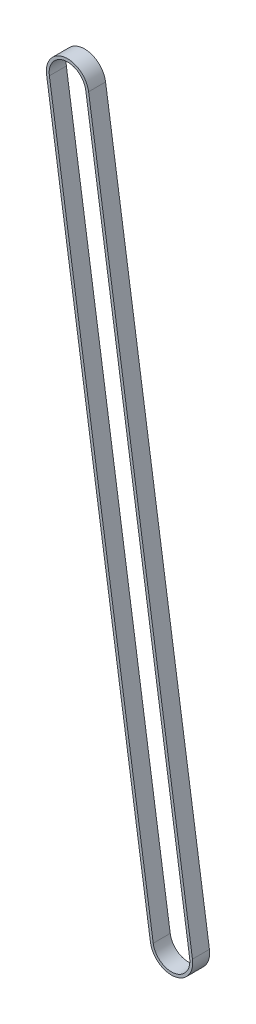
ISO-10303-21;
HEADER;
FILE_DESCRIPTION(('STEP AP214'),'2;1');
FILE_NAME('part.step','',(''),(''),'','','');
FILE_SCHEMA(('AUTOMOTIVE_DESIGN { 1 0 10303 214 1 1 1 1 }'));
ENDSEC;
DATA;
#1=APPLICATION_CONTEXT('core data for automotive mechanical design processes');
#2=APPLICATION_PROTOCOL_DEFINITION('international standard','automotive_design',2000,#1);
#3=PRODUCT_CONTEXT('',#1,'mechanical');
#4=PRODUCT('Part','Part','',(#3));
#5=PRODUCT_RELATED_PRODUCT_CATEGORY('part','',(#4));
#6=PRODUCT_DEFINITION_FORMATION('','',#4);
#7=PRODUCT_DEFINITION_CONTEXT('part definition',#1,'design');
#8=PRODUCT_DEFINITION('design','',#6,#7);
#9=PRODUCT_DEFINITION_SHAPE('','',#8);
#10=(LENGTH_UNIT() NAMED_UNIT(*) SI_UNIT(.MILLI.,.METRE.));
#11=(NAMED_UNIT(*) PLANE_ANGLE_UNIT() SI_UNIT($,.RADIAN.));
#12=(NAMED_UNIT(*) SI_UNIT($,.STERADIAN.) SOLID_ANGLE_UNIT());
#13=UNCERTAINTY_MEASURE_WITH_UNIT(LENGTH_MEASURE(1.E-05),#10,'distance_accuracy_value','');
#14=(GEOMETRIC_REPRESENTATION_CONTEXT(3) GLOBAL_UNCERTAINTY_ASSIGNED_CONTEXT((#13)) GLOBAL_UNIT_ASSIGNED_CONTEXT((#10,
#11,#12)) REPRESENTATION_CONTEXT('',''));
#15=CARTESIAN_POINT('',(0.,0.,0.));
#16=DIRECTION('',(0.,0.,1.));
#17=DIRECTION('',(1.,0.,0.));
#18=AXIS2_PLACEMENT_3D('',#15,#16,#17);
#19=CARTESIAN_POINT('',(-7.4186383957417,-1.10172789436734,6.5));
#20=DIRECTION('',(0.,0.,-1.));
#21=DIRECTION('',(0.146897052582301,-0.989151786098894,0.));
#22=AXIS2_PLACEMENT_3D('',#19,#20,#21);
#23=PLANE('',#22);
#24=DIRECTION('',(0.146897052582301,-0.989151786098894,0.));
#25=VECTOR('',#24,1.);
#26=CARTESIAN_POINT('',(-7.4186383957417,-1.10172789436734,6.5));
#27=LINE('',#26,#25);
#28=CARTESIAN_POINT('',(-44.0841426743164,245.790557606387,6.5));
#29=VERTEX_POINT('',#28);
#30=CARTESIAN_POINT('',(-7.4186383957417,-1.10172789436734,6.5));
#31=VERTEX_POINT('',#30);
#32=EDGE_CURVE('E116',#29,#31,#27,.T.);
#33=ORIENTED_EDGE('',*,*,#32,.T.);
#34=CARTESIAN_POINT('',(0.,0.,6.5));
#35=DIRECTION('',(0.,0.,1.));
#36=DIRECTION('',(1.,0.,0.));
#37=AXIS2_PLACEMENT_3D('',#34,#35,#36);
#38=CIRCLE('',#37,7.5);
#39=CARTESIAN_POINT('',(7.41863839574172,1.10172789436717,6.5));
#40=VERTEX_POINT('',#39);
#41=EDGE_CURVE('E45',#31,#40,#38,.T.);
#42=ORIENTED_EDGE('',*,*,#41,.T.);
#43=DIRECTION('',(-0.146897052582301,0.989151786098894,0.));
#44=VECTOR('',#43,1.);
#45=CARTESIAN_POINT('',(7.41863839574172,1.10172789436717,6.5));
#46=LINE('',#45,#44);
#47=CARTESIAN_POINT('',(-29.246865882833,247.994013395122,6.5));
#48=VERTEX_POINT('',#47);
#49=EDGE_CURVE('E185',#40,#48,#46,.T.);
#50=ORIENTED_EDGE('',*,*,#49,.T.);
#51=CARTESIAN_POINT('',(-36.6655042785747,246.892285500754,6.5));
#52=DIRECTION('',(0.,0.,1.));
#53=DIRECTION('',(1.,0.,0.));
#54=AXIS2_PLACEMENT_3D('',#51,#52,#53);
#55=CIRCLE('',#54,7.5);
#56=EDGE_CURVE('E161',#48,#29,#55,.T.);
#57=ORIENTED_EDGE('',*,*,#56,.T.);
#58=EDGE_LOOP('',(#33,#42,#50,#57));
#59=FACE_BOUND('',#58,.T.);
#60=DIRECTION('',(0.146897052582301,-0.989151786098894,0.));
#61=VECTOR('',#60,1.);
#62=CARTESIAN_POINT('',(-6.4294866096428,-0.95483084178504,6.5));
#63=LINE('',#62,#61);
#64=CARTESIAN_POINT('',(-43.0949908882175,245.937454658969,6.5));
#65=VERTEX_POINT('',#64);
#66=CARTESIAN_POINT('',(-6.4294866096428,-0.95483084178504,6.5));
#67=VERTEX_POINT('',#66);
#68=EDGE_CURVE('E123',#65,#67,#63,.T.);
#69=ORIENTED_EDGE('',*,*,#68,.F.);
#70=CARTESIAN_POINT('',(-36.6655042785747,246.892285500754,6.5));
#71=DIRECTION('',(0.,0.,1.));
#72=DIRECTION('',(1.,0.,0.));
#73=AXIS2_PLACEMENT_3D('',#70,#71,#72);
#74=CIRCLE('',#73,6.5);
#75=CARTESIAN_POINT('',(-30.2360176689318,247.847116342539,6.5));
#76=VERTEX_POINT('',#75);
#77=EDGE_CURVE('E129',#76,#65,#74,.T.);
#78=ORIENTED_EDGE('',*,*,#77,.F.);
#79=DIRECTION('',(-0.146897052582301,0.989151786098894,0.));
#80=VECTOR('',#79,1.);
#81=CARTESIAN_POINT('',(6.42948660964283,0.954830841784873,6.5));
#82=LINE('',#81,#80);
#83=CARTESIAN_POINT('',(6.42948660964283,0.954830841784873,6.5));
#84=VERTEX_POINT('',#83);
#85=EDGE_CURVE('E107',#84,#76,#82,.T.);
#86=ORIENTED_EDGE('',*,*,#85,.F.);
#87=CARTESIAN_POINT('',(0.,0.,6.5));
#88=DIRECTION('',(0.,0.,1.));
#89=DIRECTION('',(1.,0.,0.));
#90=AXIS2_PLACEMENT_3D('',#87,#88,#89);
#91=CIRCLE('',#90,6.5);
#92=EDGE_CURVE('E105',#67,#84,#91,.T.);
#93=ORIENTED_EDGE('',*,*,#92,.F.);
#94=EDGE_LOOP('',(#69,#78,#86,#93));
#95=FACE_BOUND('',#94,.T.);
#96=ADVANCED_FACE('F35',(#59,#95),#23,.F.);
#97=CARTESIAN_POINT('',(7.41863839574172,1.10172789436717,0.5));
#98=DIRECTION('',(0.,0.,-1.));
#99=DIRECTION('',(-0.146897052582301,0.989151786098894,0.));
#100=AXIS2_PLACEMENT_3D('',#97,#98,#99);
#101=PLANE('',#100);
#102=DIRECTION('',(-0.146897052582301,0.989151786098894,0.));
#103=VECTOR('',#102,1.);
#104=CARTESIAN_POINT('',(7.41863839574172,1.10172789436717,0.5));
#105=LINE('',#104,#103);
#106=CARTESIAN_POINT('',(7.41863839574172,1.10172789436717,0.5));
#107=VERTEX_POINT('',#106);
#108=CARTESIAN_POINT('',(-29.246865882833,247.994013395122,0.5));
#109=VERTEX_POINT('',#108);
#110=EDGE_CURVE('E54',#107,#109,#105,.T.);
#111=ORIENTED_EDGE('',*,*,#110,.F.);
#112=CARTESIAN_POINT('',(0.,0.,0.5));
#113=DIRECTION('',(0.,0.,1.));
#114=DIRECTION('',(1.,0.,0.));
#115=AXIS2_PLACEMENT_3D('',#112,#113,#114);
#116=CIRCLE('',#115,7.5);
#117=CARTESIAN_POINT('',(-7.4186383957417,-1.10172789436734,0.5));
#118=VERTEX_POINT('',#117);
#119=EDGE_CURVE('E11',#118,#107,#116,.T.);
#120=ORIENTED_EDGE('',*,*,#119,.F.);
#121=DIRECTION('',(0.146897052582301,-0.989151786098894,0.));
#122=VECTOR('',#121,1.);
#123=CARTESIAN_POINT('',(-7.4186383957417,-1.10172789436734,0.5));
#124=LINE('',#123,#122);
#125=CARTESIAN_POINT('',(-44.0841426743164,245.790557606387,0.5));
#126=VERTEX_POINT('',#125);
#127=EDGE_CURVE('E175',#126,#118,#124,.T.);
#128=ORIENTED_EDGE('',*,*,#127,.F.);
#129=CARTESIAN_POINT('',(-36.6655042785747,246.892285500754,0.5));
#130=DIRECTION('',(0.,0.,1.));
#131=DIRECTION('',(1.,0.,0.));
#132=AXIS2_PLACEMENT_3D('',#129,#130,#131);
#133=CIRCLE('',#132,7.5);
#134=EDGE_CURVE('E184',#109,#126,#133,.T.);
#135=ORIENTED_EDGE('',*,*,#134,.F.);
#136=EDGE_LOOP('',(#111,#120,#128,#135));
#137=FACE_BOUND('',#136,.T.);
#138=DIRECTION('',(-0.146897052582301,0.989151786098894,0.));
#139=VECTOR('',#138,1.);
#140=CARTESIAN_POINT('',(6.42948660964283,0.954830841784873,0.5));
#141=LINE('',#140,#139);
#142=CARTESIAN_POINT('',(6.42948660964283,0.954830841784873,0.5));
#143=VERTEX_POINT('',#142);
#144=CARTESIAN_POINT('',(-30.2360176689318,247.847116342539,0.5));
#145=VERTEX_POINT('',#144);
#146=EDGE_CURVE('E39',#143,#145,#141,.T.);
#147=ORIENTED_EDGE('',*,*,#146,.T.);
#148=CARTESIAN_POINT('',(-36.6655042785747,246.892285500754,0.5));
#149=DIRECTION('',(0.,0.,1.));
#150=DIRECTION('',(1.,0.,0.));
#151=AXIS2_PLACEMENT_3D('',#148,#149,#150);
#152=CIRCLE('',#151,6.5);
#153=CARTESIAN_POINT('',(-43.0949908882175,245.937454658969,0.5));
#154=VERTEX_POINT('',#153);
#155=EDGE_CURVE('E127',#145,#154,#152,.T.);
#156=ORIENTED_EDGE('',*,*,#155,.T.);
#157=DIRECTION('',(0.146897052582301,-0.989151786098894,0.));
#158=VECTOR('',#157,1.);
#159=CARTESIAN_POINT('',(-6.4294866096428,-0.95483084178504,0.5));
#160=LINE('',#159,#158);
#161=CARTESIAN_POINT('',(-6.4294866096428,-0.954830841785039,0.5));
#162=VERTEX_POINT('',#161);
#163=EDGE_CURVE('E115',#154,#162,#160,.T.);
#164=ORIENTED_EDGE('',*,*,#163,.T.);
#165=CARTESIAN_POINT('',(0.,0.,0.5));
#166=DIRECTION('',(0.,0.,1.));
#167=DIRECTION('',(1.,0.,0.));
#168=AXIS2_PLACEMENT_3D('',#165,#166,#167);
#169=CIRCLE('',#168,6.5);
#170=EDGE_CURVE('E103',#162,#143,#169,.T.);
#171=ORIENTED_EDGE('',*,*,#170,.T.);
#172=EDGE_LOOP('',(#147,#156,#164,#171));
#173=FACE_BOUND('',#172,.T.);
#174=ADVANCED_FACE('F37',(#137,#173),#101,.T.);
#175=CARTESIAN_POINT('',(0.,0.,0.5));
#176=DIRECTION('',(0.,0.,1.));
#177=DIRECTION('',(1.,0.,0.));
#178=AXIS2_PLACEMENT_3D('',#175,#176,#177);
#179=CYLINDRICAL_SURFACE('',#178,7.5);
#180=ORIENTED_EDGE('',*,*,#41,.F.);
#181=DIRECTION('',(0.,0.,1.));
#182=VECTOR('',#181,1.);
#183=CARTESIAN_POINT('',(-7.4186383957417,-1.10172789436734,0.5));
#184=LINE('',#183,#182);
#185=EDGE_CURVE('E168',#118,#31,#184,.T.);
#186=ORIENTED_EDGE('',*,*,#185,.F.);
#187=ORIENTED_EDGE('',*,*,#119,.T.);
#188=DIRECTION('',(0.,0.,1.));
#189=VECTOR('',#188,1.);
#190=CARTESIAN_POINT('',(7.41863839574172,1.10172789436717,0.5));
#191=LINE('',#190,#189);
#192=EDGE_CURVE('E170',#107,#40,#191,.T.);
#193=ORIENTED_EDGE('',*,*,#192,.T.);
#194=EDGE_LOOP('',(#180,#186,#187,#193));
#195=FACE_BOUND('',#194,.T.);
#196=ADVANCED_FACE('F155',(#195),#179,.T.);
#197=CARTESIAN_POINT('',(7.41863839574172,1.10172789436717,0.5));
#198=DIRECTION('',(0.989151786098894,0.146897052582301,0.));
#199=DIRECTION('',(-0.146897052582301,0.989151786098894,0.));
#200=AXIS2_PLACEMENT_3D('',#197,#198,#199);
#201=PLANE('',#200);
#202=ORIENTED_EDGE('',*,*,#49,.F.);
#203=ORIENTED_EDGE('',*,*,#192,.F.);
#204=ORIENTED_EDGE('',*,*,#110,.T.);
#205=DIRECTION('',(0.,0.,1.));
#206=VECTOR('',#205,1.);
#207=CARTESIAN_POINT('',(-29.246865882833,247.994013395122,0.5));
#208=LINE('',#207,#206);
#209=EDGE_CURVE('E177',#109,#48,#208,.T.);
#210=ORIENTED_EDGE('',*,*,#209,.T.);
#211=EDGE_LOOP('',(#202,#203,#204,#210));
#212=FACE_BOUND('',#211,.T.);
#213=ADVANCED_FACE('F195',(#212),#201,.T.);
#214=CARTESIAN_POINT('',(-36.6655042785747,246.892285500754,0.5));
#215=DIRECTION('',(0.,0.,1.));
#216=DIRECTION('',(1.,0.,0.));
#217=AXIS2_PLACEMENT_3D('',#214,#215,#216);
#218=CYLINDRICAL_SURFACE('',#217,7.5);
#219=ORIENTED_EDGE('',*,*,#56,.F.);
#220=ORIENTED_EDGE('',*,*,#209,.F.);
#221=ORIENTED_EDGE('',*,*,#134,.T.);
#222=DIRECTION('',(0.,0.,1.));
#223=VECTOR('',#222,1.);
#224=CARTESIAN_POINT('',(-44.0841426743164,245.790557606387,0.5));
#225=LINE('',#224,#223);
#226=EDGE_CURVE('E118',#126,#29,#225,.T.);
#227=ORIENTED_EDGE('',*,*,#226,.T.);
#228=EDGE_LOOP('',(#219,#220,#221,#227));
#229=FACE_BOUND('',#228,.T.);
#230=ADVANCED_FACE('F192',(#229),#218,.T.);
#231=CARTESIAN_POINT('',(-7.4186383957417,-1.10172789436734,0.5));
#232=DIRECTION('',(-0.989151786098894,-0.146897052582301,0.));
#233=DIRECTION('',(0.146897052582301,-0.989151786098894,0.));
#234=AXIS2_PLACEMENT_3D('',#231,#232,#233);
#235=PLANE('',#234);
#236=ORIENTED_EDGE('',*,*,#32,.F.);
#237=ORIENTED_EDGE('',*,*,#226,.F.);
#238=ORIENTED_EDGE('',*,*,#127,.T.);
#239=ORIENTED_EDGE('',*,*,#185,.T.);
#240=EDGE_LOOP('',(#236,#237,#238,#239));
#241=FACE_BOUND('',#240,.T.);
#242=ADVANCED_FACE('F173',(#241),#235,.T.);
#243=CARTESIAN_POINT('',(0.,0.,0.5));
#244=DIRECTION('',(0.,0.,1.));
#245=DIRECTION('',(1.,0.,0.));
#246=AXIS2_PLACEMENT_3D('',#243,#244,#245);
#247=CYLINDRICAL_SURFACE('',#246,6.5);
#248=ORIENTED_EDGE('',*,*,#92,.T.);
#249=DIRECTION('',(0.,0.,1.));
#250=VECTOR('',#249,1.);
#251=CARTESIAN_POINT('',(6.42948660964283,0.954830841784873,0.5));
#252=LINE('',#251,#250);
#253=EDGE_CURVE('E100',#143,#84,#252,.T.);
#254=ORIENTED_EDGE('',*,*,#253,.F.);
#255=ORIENTED_EDGE('',*,*,#170,.F.);
#256=DIRECTION('',(0.,0.,1.));
#257=VECTOR('',#256,1.);
#258=CARTESIAN_POINT('',(-6.4294866096428,-0.95483084178504,0.5));
#259=LINE('',#258,#257);
#260=EDGE_CURVE('E125',#162,#67,#259,.T.);
#261=ORIENTED_EDGE('',*,*,#260,.T.);
#262=EDGE_LOOP('',(#248,#254,#255,#261));
#263=FACE_BOUND('',#262,.T.);
#264=ADVANCED_FACE('F101',(#263),#247,.F.);
#265=CARTESIAN_POINT('',(6.42948660964283,0.954830841784873,0.5));
#266=DIRECTION('',(0.989151786098894,0.146897052582301,0.));
#267=DIRECTION('',(-0.146897052582301,0.989151786098894,0.));
#268=AXIS2_PLACEMENT_3D('',#265,#266,#267);
#269=PLANE('',#268);
#270=ORIENTED_EDGE('',*,*,#85,.T.);
#271=DIRECTION('',(0.,0.,1.));
#272=VECTOR('',#271,1.);
#273=CARTESIAN_POINT('',(-30.2360176689318,247.847116342539,0.5));
#274=LINE('',#273,#272);
#275=EDGE_CURVE('E94',#145,#76,#274,.T.);
#276=ORIENTED_EDGE('',*,*,#275,.F.);
#277=ORIENTED_EDGE('',*,*,#146,.F.);
#278=ORIENTED_EDGE('',*,*,#253,.T.);
#279=EDGE_LOOP('',(#270,#276,#277,#278));
#280=FACE_BOUND('',#279,.T.);
#281=ADVANCED_FACE('F110',(#280),#269,.F.);
#282=CARTESIAN_POINT('',(-36.6655042785747,246.892285500754,0.5));
#283=DIRECTION('',(0.,0.,1.));
#284=DIRECTION('',(1.,0.,0.));
#285=AXIS2_PLACEMENT_3D('',#282,#283,#284);
#286=CYLINDRICAL_SURFACE('',#285,6.5);
#287=ORIENTED_EDGE('',*,*,#77,.T.);
#288=DIRECTION('',(0.,0.,1.));
#289=VECTOR('',#288,1.);
#290=CARTESIAN_POINT('',(-43.0949908882175,245.937454658969,0.5));
#291=LINE('',#290,#289);
#292=EDGE_CURVE('E126',#154,#65,#291,.T.);
#293=ORIENTED_EDGE('',*,*,#292,.F.);
#294=ORIENTED_EDGE('',*,*,#155,.F.);
#295=ORIENTED_EDGE('',*,*,#275,.T.);
#296=EDGE_LOOP('',(#287,#293,#294,#295));
#297=FACE_BOUND('',#296,.T.);
#298=ADVANCED_FACE('F141',(#297),#286,.F.);
#299=CARTESIAN_POINT('',(-6.4294866096428,-0.95483084178504,0.5));
#300=DIRECTION('',(-0.989151786098894,-0.146897052582301,0.));
#301=DIRECTION('',(0.146897052582301,-0.989151786098894,0.));
#302=AXIS2_PLACEMENT_3D('',#299,#300,#301);
#303=PLANE('',#302);
#304=ORIENTED_EDGE('',*,*,#68,.T.);
#305=ORIENTED_EDGE('',*,*,#260,.F.);
#306=ORIENTED_EDGE('',*,*,#163,.F.);
#307=ORIENTED_EDGE('',*,*,#292,.T.);
#308=EDGE_LOOP('',(#304,#305,#306,#307));
#309=FACE_BOUND('',#308,.T.);
#310=ADVANCED_FACE('F138',(#309),#303,.F.);
#311=CLOSED_SHELL('',(#96,#174,#196,#213,#230,#242,#264,#281,#298,#310));
#312=MANIFOLD_SOLID_BREP('B2',#311);
#313=ADVANCED_BREP_SHAPE_REPRESENTATION('',(#18,#312),#14);
#314=SHAPE_DEFINITION_REPRESENTATION(#9,#313);
ENDSEC;
END-ISO-10303-21;
